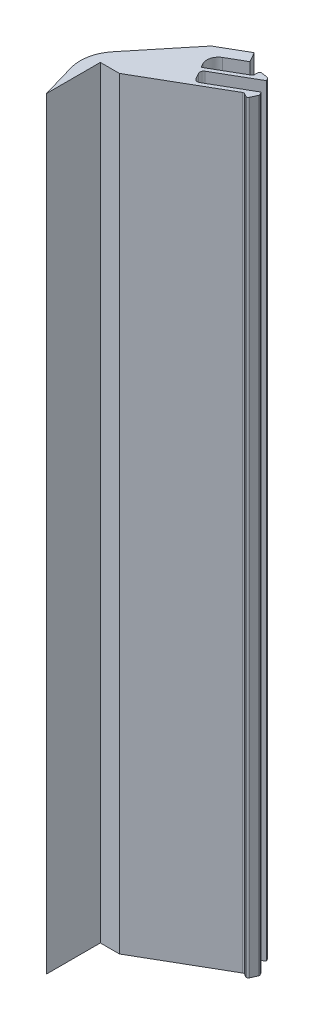
ISO-10303-21;
HEADER;
FILE_DESCRIPTION(('STEP AP214'),'2;1');
FILE_NAME('part.step','',(''),(''),'','','');
FILE_SCHEMA(('AUTOMOTIVE_DESIGN { 1 0 10303 214 1 1 1 1 }'));
ENDSEC;
DATA;
#1=APPLICATION_CONTEXT('core data for automotive mechanical design processes');
#2=APPLICATION_PROTOCOL_DEFINITION('international standard','automotive_design',2000,#1);
#3=PRODUCT_CONTEXT('',#1,'mechanical');
#4=PRODUCT('Part','Part','',(#3));
#5=PRODUCT_RELATED_PRODUCT_CATEGORY('part','',(#4));
#6=PRODUCT_DEFINITION_FORMATION('','',#4);
#7=PRODUCT_DEFINITION_CONTEXT('part definition',#1,'design');
#8=PRODUCT_DEFINITION('design','',#6,#7);
#9=PRODUCT_DEFINITION_SHAPE('','',#8);
#10=(LENGTH_UNIT() NAMED_UNIT(*) SI_UNIT(.MILLI.,.METRE.));
#11=(NAMED_UNIT(*) PLANE_ANGLE_UNIT() SI_UNIT($,.RADIAN.));
#12=(NAMED_UNIT(*) SI_UNIT($,.STERADIAN.) SOLID_ANGLE_UNIT());
#13=UNCERTAINTY_MEASURE_WITH_UNIT(LENGTH_MEASURE(1.E-05),#10,'distance_accuracy_value','');
#14=(GEOMETRIC_REPRESENTATION_CONTEXT(3) GLOBAL_UNCERTAINTY_ASSIGNED_CONTEXT((#13)) GLOBAL_UNIT_ASSIGNED_CONTEXT((#10,
#11,#12)) REPRESENTATION_CONTEXT('',''));
#15=CARTESIAN_POINT('',(0.,0.,0.));
#16=DIRECTION('',(0.,0.,1.));
#17=DIRECTION('',(1.,0.,0.));
#18=AXIS2_PLACEMENT_3D('',#15,#16,#17);
#19=CARTESIAN_POINT('',(8.1826482930344,243.460611683437,-2.42948600012822));
#20=DIRECTION('',(-0.866025403784439,0.,0.5));
#21=DIRECTION('',(0.5,0.,0.866025403784439));
#22=AXIS2_PLACEMENT_3D('',#19,#20,#21);
#23=PLANE('',#22);
#24=DIRECTION('',(-0.5,0.,-0.866025403784439));
#25=VECTOR('',#24,1.);
#26=CARTESIAN_POINT('',(8.1826482930344,0.,-2.42948600012822));
#27=LINE('',#26,#25);
#28=CARTESIAN_POINT('',(7.1826482930344,0.,-4.1615368076971));
#29=VERTEX_POINT('',#28);
#30=CARTESIAN_POINT('',(6.28264829303443,0.,-5.72038253450904));
#31=VERTEX_POINT('',#30);
#32=EDGE_CURVE('E315',#29,#31,#27,.T.);
#33=ORIENTED_EDGE('',*,*,#32,.T.);
#34=DIRECTION('',(0.,1.,0.));
#35=VECTOR('',#34,1.);
#36=CARTESIAN_POINT('',(6.28264829303443,200.,-5.72038253450904));
#37=LINE('',#36,#35);
#38=CARTESIAN_POINT('',(6.28264829303443,200.,-5.72038253450904));
#39=VERTEX_POINT('',#38);
#40=EDGE_CURVE('E423',#31,#39,#37,.T.);
#41=ORIENTED_EDGE('',*,*,#40,.T.);
#42=DIRECTION('',(-0.5,0.,-0.866025403784439));
#43=VECTOR('',#42,1.);
#44=CARTESIAN_POINT('',(8.1826482930344,200.,-2.42948600012822));
#45=LINE('',#44,#43);
#46=CARTESIAN_POINT('',(7.1826482930344,200.,-4.1615368076971));
#47=VERTEX_POINT('',#46);
#48=EDGE_CURVE('E337',#47,#39,#45,.T.);
#49=ORIENTED_EDGE('',*,*,#48,.F.);
#50=DIRECTION('',(0.,1.,0.));
#51=VECTOR('',#50,1.);
#52=CARTESIAN_POINT('',(7.1826482930344,0.,-4.1615368076971));
#53=LINE('',#52,#51);
#54=EDGE_CURVE('E421',#47,#29,#53,.F.);
#55=ORIENTED_EDGE('',*,*,#54,.T.);
#56=EDGE_LOOP('',(#33,#41,#49,#55));
#57=FACE_BOUND('',#56,.T.);
#58=ADVANCED_FACE('F32',(#57),#23,.F.);
#59=CARTESIAN_POINT('',(13.9270821271293,200.,-12.4432995431845));
#60=DIRECTION('',(0.5,0.,0.866025403784438));
#61=DIRECTION('',(0.866025403784439,0.,-0.5));
#62=AXIS2_PLACEMENT_3D('',#59,#60,#61);
#63=PLANE('',#62);
#64=DIRECTION('',(0.,-1.,0.));
#65=VECTOR('',#64,1.);
#66=CARTESIAN_POINT('',(5.28264829303443,200.,-7.45243334207792));
#67=LINE('',#66,#65);
#68=CARTESIAN_POINT('',(5.28264829303442,200.,-7.45243334207792));
#69=VERTEX_POINT('',#68);
#70=CARTESIAN_POINT('',(5.28264829303442,0.,-7.45243334207792));
#71=VERTEX_POINT('',#70);
#72=EDGE_CURVE('E324',#69,#71,#67,.T.);
#73=ORIENTED_EDGE('',*,*,#72,.F.);
#74=DIRECTION('',(-0.866025403784438,0.,0.5));
#75=VECTOR('',#74,1.);
#76=CARTESIAN_POINT('',(13.9270821271293,200.,-12.4432995431845));
#77=LINE('',#76,#75);
#78=CARTESIAN_POINT('',(13.6770821271293,200.,-12.2989619758871));
#79=VERTEX_POINT('',#78);
#80=EDGE_CURVE('E358',#79,#69,#77,.T.);
#81=ORIENTED_EDGE('',*,*,#80,.F.);
#82=DIRECTION('',(0.,-1.,0.));
#83=VECTOR('',#82,1.);
#84=CARTESIAN_POINT('',(13.6770821271293,0.,-12.2989619758871));
#85=LINE('',#84,#83);
#86=CARTESIAN_POINT('',(13.6770821271293,0.,-12.2989619758871));
#87=VERTEX_POINT('',#86);
#88=EDGE_CURVE('E405',#79,#87,#85,.T.);
#89=ORIENTED_EDGE('',*,*,#88,.T.);
#90=DIRECTION('',(-0.866025403784438,0.,0.5));
#91=VECTOR('',#90,1.);
#92=CARTESIAN_POINT('',(13.9270821271293,0.,-12.4432995431845));
#93=LINE('',#92,#91);
#94=EDGE_CURVE('E373',#87,#71,#93,.T.);
#95=ORIENTED_EDGE('',*,*,#94,.T.);
#96=EDGE_LOOP('',(#73,#81,#89,#95));
#97=FACE_BOUND('',#96,.T.);
#98=ADVANCED_FACE('F464',(#97),#63,.F.);
#99=CARTESIAN_POINT('',(16.8519532577256,200.,-12.9772741394));
#100=DIRECTION('',(-0.5,0.,-0.866025403784439));
#101=DIRECTION('',(-0.866025403784439,0.,0.5));
#102=AXIS2_PLACEMENT_3D('',#99,#100,#101);
#103=PLANE('',#102);
#104=DIRECTION('',(0.866025403784439,0.,-0.5));
#105=VECTOR('',#104,1.);
#106=CARTESIAN_POINT('',(16.8519532577256,200.,-12.9772741394));
#107=LINE('',#106,#105);
#108=CARTESIAN_POINT('',(6.64867369681886,200.,-7.08640793829348));
#109=VERTEX_POINT('',#108);
#110=CARTESIAN_POINT('',(16.8519532577256,200.,-12.9772741394));
#111=VERTEX_POINT('',#110);
#112=EDGE_CURVE('E362',#109,#111,#107,.T.);
#113=ORIENTED_EDGE('',*,*,#112,.F.);
#114=DIRECTION('',(0.,1.,0.));
#115=VECTOR('',#114,1.);
#116=CARTESIAN_POINT('',(6.64867369681886,0.,-7.08640793829348));
#117=LINE('',#116,#115);
#118=CARTESIAN_POINT('',(6.64867369681886,0.,-7.08640793829348));
#119=VERTEX_POINT('',#118);
#120=EDGE_CURVE('E426',#109,#119,#117,.F.);
#121=ORIENTED_EDGE('',*,*,#120,.T.);
#122=DIRECTION('',(0.866025403784439,0.,-0.5));
#123=VECTOR('',#122,1.);
#124=CARTESIAN_POINT('',(16.8519532577256,0.,-12.9772741394));
#125=LINE('',#124,#123);
#126=CARTESIAN_POINT('',(16.8519532577256,0.,-12.9772741394));
#127=VERTEX_POINT('',#126);
#128=EDGE_CURVE('E376',#119,#127,#125,.T.);
#129=ORIENTED_EDGE('',*,*,#128,.T.);
#130=DIRECTION('',(0.,-1.,0.));
#131=VECTOR('',#130,1.);
#132=CARTESIAN_POINT('',(16.8519532577256,200.,-12.9772741394));
#133=LINE('',#132,#131);
#134=EDGE_CURVE('E370',#111,#127,#133,.T.);
#135=ORIENTED_EDGE('',*,*,#134,.F.);
#136=EDGE_LOOP('',(#113,#121,#129,#135));
#137=FACE_BOUND('',#136,.T.);
#138=ADVANCED_FACE('F471',(#137),#103,.F.);
#139=CARTESIAN_POINT('',(13.9270821271293,200.,-14.1753503507534));
#140=DIRECTION('',(1.,0.,0.));
#141=DIRECTION('',(0.,0.,-1.));
#142=AXIS2_PLACEMENT_3D('',#139,#140,#141);
#143=PLANE('',#142);
#144=DIRECTION('',(0.,0.,1.));
#145=VECTOR('',#144,1.);
#146=CARTESIAN_POINT('',(13.9270821271293,200.,-14.1753503507534));
#147=LINE('',#146,#145);
#148=CARTESIAN_POINT('',(13.9270821271293,200.,-13.6022165712618));
#149=VERTEX_POINT('',#148);
#150=CARTESIAN_POINT('',(13.9270821271293,200.,-12.7319746777793));
#151=VERTEX_POINT('',#150);
#152=EDGE_CURVE('E355',#149,#151,#147,.T.);
#153=ORIENTED_EDGE('',*,*,#152,.F.);
#154=DIRECTION('',(0.,-1.,0.));
#155=VECTOR('',#154,1.);
#156=CARTESIAN_POINT('',(13.9270821271293,200.,-13.6022165712618));
#157=LINE('',#156,#155);
#158=CARTESIAN_POINT('',(13.9270821271293,0.,-13.6022165712618));
#159=VERTEX_POINT('',#158);
#160=EDGE_CURVE('E402',#149,#159,#157,.T.);
#161=ORIENTED_EDGE('',*,*,#160,.T.);
#162=DIRECTION('',(0.,0.,1.));
#163=VECTOR('',#162,1.);
#164=CARTESIAN_POINT('',(13.9270821271293,0.,-14.1753503507534));
#165=LINE('',#164,#163);
#166=CARTESIAN_POINT('',(13.9270821271293,0.,-12.7319746777793));
#167=VERTEX_POINT('',#166);
#168=EDGE_CURVE('E354',#159,#167,#165,.T.);
#169=ORIENTED_EDGE('',*,*,#168,.T.);
#170=DIRECTION('',(0.,-1.,0.));
#171=VECTOR('',#170,1.);
#172=CARTESIAN_POINT('',(13.9270821271293,200.,-12.7319746777793));
#173=LINE('',#172,#171);
#174=EDGE_CURVE('E400',#167,#151,#173,.F.);
#175=ORIENTED_EDGE('',*,*,#174,.T.);
#176=EDGE_LOOP('',(#153,#161,#169,#175));
#177=FACE_BOUND('',#176,.T.);
#178=ADVANCED_FACE('F496',(#177),#143,.F.);
#179=CARTESIAN_POINT('',(16.3519532577256,200.,-13.8432995431844));
#180=DIRECTION('',(-0.866025403784438,0.,0.500000000000001));
#181=DIRECTION('',(0.500000000000001,0.,0.866025403784438));
#182=AXIS2_PLACEMENT_3D('',#179,#180,#181);
#183=PLANE('',#182);
#184=DIRECTION('',(-0.500000000000001,0.,-0.866025403784438));
#185=VECTOR('',#184,1.);
#186=CARTESIAN_POINT('',(16.3519532577256,0.,-13.8432995431844));
#187=LINE('',#186,#185);
#188=CARTESIAN_POINT('',(16.4744342233498,0.,-13.6311562877632));
#189=VERTEX_POINT('',#188);
#190=EDGE_CURVE('E378',#127,#189,#187,.T.);
#191=ORIENTED_EDGE('',*,*,#190,.T.);
#192=DIRECTION('',(0.,-1.,0.));
#193=VECTOR('',#192,1.);
#194=CARTESIAN_POINT('',(16.4744342233498,200.,-13.6311562877632));
#195=LINE('',#194,#193);
#196=CARTESIAN_POINT('',(16.4744342233498,200.,-13.6311562877632));
#197=VERTEX_POINT('',#196);
#198=EDGE_CURVE('E394',#189,#197,#195,.F.);
#199=ORIENTED_EDGE('',*,*,#198,.T.);
#200=DIRECTION('',(-0.500000000000001,0.,-0.866025403784438));
#201=VECTOR('',#200,1.);
#202=CARTESIAN_POINT('',(16.3519532577256,200.,-13.8432995431844));
#203=LINE('',#202,#201);
#204=EDGE_CURVE('E364',#111,#197,#203,.T.);
#205=ORIENTED_EDGE('',*,*,#204,.F.);
#206=ORIENTED_EDGE('',*,*,#134,.T.);
#207=EDGE_LOOP('',(#191,#199,#205,#206));
#208=FACE_BOUND('',#207,.T.);
#209=ADVANCED_FACE('F513',(#208),#183,.F.);
#210=CARTESIAN_POINT('',(13.9270821271293,200.,-14.1753503507534));
#211=DIRECTION('',(-0.135669363148245,0.,0.990754169258424));
#212=DIRECTION('',(0.990754169258424,0.,0.135669363148245));
#213=AXIS2_PLACEMENT_3D('',#210,#211,#212);
#214=PLANE('',#213);
#215=DIRECTION('',(-0.990754169258424,0.,-0.135669363148245));
#216=VECTOR('',#215,1.);
#217=CARTESIAN_POINT('',(13.9270821271293,200.,-14.1753503507534));
#218=LINE('',#217,#216);
#219=CARTESIAN_POINT('',(16.1092562030317,200.,-13.8765333723924));
#220=VERTEX_POINT('',#219);
#221=CARTESIAN_POINT('',(14.4949168087034,200.,-14.097593655891));
#222=VERTEX_POINT('',#221);
#223=EDGE_CURVE('E367',#220,#222,#218,.T.);
#224=ORIENTED_EDGE('',*,*,#223,.F.);
#225=DIRECTION('',(0.,-1.,0.));
#226=VECTOR('',#225,1.);
#227=CARTESIAN_POINT('',(16.1092562030317,200.,-13.8765333723924));
#228=LINE('',#227,#226);
#229=CARTESIAN_POINT('',(16.1092562030317,0.,-13.8765333723924));
#230=VERTEX_POINT('',#229);
#231=EDGE_CURVE('E387',#220,#230,#228,.T.);
#232=ORIENTED_EDGE('',*,*,#231,.T.);
#233=DIRECTION('',(-0.990754169258424,0.,-0.135669363148245));
#234=VECTOR('',#233,1.);
#235=CARTESIAN_POINT('',(13.9270821271293,0.,-14.1753503507534));
#236=LINE('',#235,#234);
#237=CARTESIAN_POINT('',(14.4949168087034,0.,-14.097593655891));
#238=VERTEX_POINT('',#237);
#239=EDGE_CURVE('E359',#230,#238,#236,.T.);
#240=ORIENTED_EDGE('',*,*,#239,.T.);
#241=DIRECTION('',(0.,-1.,0.));
#242=VECTOR('',#241,1.);
#243=CARTESIAN_POINT('',(14.4949168087034,200.,-14.097593655891));
#244=LINE('',#243,#242);
#245=EDGE_CURVE('E385',#238,#222,#244,.F.);
#246=ORIENTED_EDGE('',*,*,#245,.T.);
#247=EDGE_LOOP('',(#224,#232,#240,#246));
#248=FACE_BOUND('',#247,.T.);
#249=ADVANCED_FACE('F504',(#248),#214,.F.);
#250=CARTESIAN_POINT('',(0.,200.,0.));
#251=DIRECTION('',(0.,1.,0.));
#252=DIRECTION('',(0.,0.,1.));
#253=AXIS2_PLACEMENT_3D('',#250,#251,#252);
#254=PLANE('',#253);
#255=DIRECTION('',(-0.632362458861427,0.,0.774672653849825));
#256=VECTOR('',#255,1.);
#257=CARTESIAN_POINT('',(1.73264829303436,200.,-13.6012137089475));
#258=LINE('',#257,#256);
#259=CARTESIAN_POINT('',(1.73264829303436,200.,-13.6012137089475));
#260=VERTEX_POINT('',#259);
#261=CARTESIAN_POINT('',(-9.84711628049156,200.,0.584522378676946));
#262=VERTEX_POINT('',#261);
#263=EDGE_CURVE('E327',#260,#262,#258,.T.);
#264=ORIENTED_EDGE('',*,*,#263,.T.);
#265=CARTESIAN_POINT('',(-2.10038974199331,200.,6.90814696729122));
#266=DIRECTION('',(0.,1.,0.));
#267=DIRECTION('',(0.,0.,1.));
#268=AXIS2_PLACEMENT_3D('',#265,#266,#267);
#269=CIRCLE('',#268,10.);
#270=CARTESIAN_POINT('',(-11.7068406298747,200.,9.68593409713461));
#271=VERTEX_POINT('',#270);
#272=EDGE_CURVE('E419',#262,#271,#269,.T.);
#273=ORIENTED_EDGE('',*,*,#272,.T.);
#274=DIRECTION('',(0.277778712984339,0.,0.960645088788135));
#275=VECTOR('',#274,1.);
#276=CARTESIAN_POINT('',(-13.1637371805032,200.,4.64753320169742));
#277=LINE('',#276,#275);
#278=CARTESIAN_POINT('',(-9.07510853066845,200.,18.7872813132227));
#279=VERTEX_POINT('',#278);
#280=EDGE_CURVE('E325',#271,#279,#277,.T.);
#281=ORIENTED_EDGE('',*,*,#280,.T.);
#282=DIRECTION('',(0.,0.,-1.));
#283=VECTOR('',#282,1.);
#284=CARTESIAN_POINT('',(-9.07510853066845,200.,18.7872813132227));
#285=LINE('',#284,#283);
#286=CARTESIAN_POINT('',(-9.07510853066845,200.,4.64753320169742));
#287=VERTEX_POINT('',#286);
#288=EDGE_CURVE('E321',#279,#287,#285,.T.);
#289=ORIENTED_EDGE('',*,*,#288,.T.);
#290=DIRECTION('',(1.,0.,0.));
#291=VECTOR('',#290,1.);
#292=CARTESIAN_POINT('',(-9.07510853066845,200.,4.64753320169742));
#293=LINE('',#292,#291);
#294=CARTESIAN_POINT('',(-4.07510853066814,200.,4.64753320169742));
#295=VERTEX_POINT('',#294);
#296=EDGE_CURVE('E293',#287,#295,#293,.T.);
#297=ORIENTED_EDGE('',*,*,#296,.T.);
#298=DIRECTION('',(0.866025403784439,0.,-0.5));
#299=VECTOR('',#298,1.);
#300=CARTESIAN_POINT('',(8.1826482930344,200.,-2.42948600012822));
#301=LINE('',#300,#299);
#302=CARTESIAN_POINT('',(16.4038770463722,200.,-7.1760146339373));
#303=VERTEX_POINT('',#302);
#304=EDGE_CURVE('E341',#295,#303,#301,.T.);
#305=ORIENTED_EDGE('',*,*,#304,.T.);
#306=CARTESIAN_POINT('',(16.6538770463722,200.,-6.74300193204508));
#307=DIRECTION('',(0.,-1.,0.));
#308=DIRECTION('',(0.,0.,-1.));
#309=AXIS2_PLACEMENT_3D('',#306,#307,#308);
#310=CIRCLE('',#309,0.5);
#311=CARTESIAN_POINT('',(16.9038770463722,200.,-7.1760146339373));
#312=VERTEX_POINT('',#311);
#313=EDGE_CURVE('E287',#303,#312,#310,.T.);
#314=ORIENTED_EDGE('',*,*,#313,.T.);
#315=DIRECTION('',(0.866025403784425,0.,0.500000000000023));
#316=VECTOR('',#315,1.);
#317=CARTESIAN_POINT('',(18.1538770463723,200.,-6.4543267974502));
#318=LINE('',#317,#316);
#319=CARTESIAN_POINT('',(17.6804654789403,200.,-6.72765109334452));
#320=VERTEX_POINT('',#319);
#321=EDGE_CURVE('E261',#312,#320,#318,.T.);
#322=ORIENTED_EDGE('',*,*,#321,.T.);
#323=CARTESIAN_POINT('',(17.9304654789404,200.,-7.16066379523674));
#324=DIRECTION('',(0.,-1.,0.));
#325=DIRECTION('',(0.,0.,-1.));
#326=AXIS2_PLACEMENT_3D('',#323,#324,#325);
#327=CIRCLE('',#326,0.5);
#328=CARTESIAN_POINT('',(18.3840018489243,200.,-6.95017683340349));
#329=VERTEX_POINT('',#328);
#330=EDGE_CURVE('E273',#320,#329,#327,.F.);
#331=ORIENTED_EDGE('',*,*,#330,.T.);
#332=DIRECTION('',(0.420973923666491,0.,-0.907072739967881));
#333=VECTOR('',#332,1.);
#334=CARTESIAN_POINT('',(19.2519532577256,200.,-8.82035220123472));
#335=LINE('',#334,#333);
#336=CARTESIAN_POINT('',(19.1426231544804,200.,-8.58477856891134));
#337=VERTEX_POINT('',#336);
#338=EDGE_CURVE('E234',#329,#337,#335,.T.);
#339=ORIENTED_EDGE('',*,*,#338,.T.);
#340=CARTESIAN_POINT('',(18.6890867844965,200.,-8.79526553074459));
#341=DIRECTION('',(0.,-1.,0.));
#342=DIRECTION('',(0.,0.,-1.));
#343=AXIS2_PLACEMENT_3D('',#340,#341,#342);
#344=CIRCLE('',#343,0.5);
#345=CARTESIAN_POINT('',(19.1220994863887,200.,-9.04526553074459));
#346=VERTEX_POINT('',#345);
#347=EDGE_CURVE('E230',#337,#346,#344,.F.);
#348=ORIENTED_EDGE('',*,*,#347,.T.);
#349=DIRECTION('',(-0.500000000000001,0.,-0.866025403784438));
#350=VECTOR('',#349,1.);
#351=CARTESIAN_POINT('',(18.7519532577255,200.,-9.68637760501915));
#352=LINE('',#351,#350);
#353=CARTESIAN_POINT('',(18.7519532577255,200.,-9.68637760501915));
#354=VERTEX_POINT('',#353);
#355=EDGE_CURVE('E222',#346,#354,#352,.T.);
#356=ORIENTED_EDGE('',*,*,#355,.T.);
#357=DIRECTION('',(-0.866025403784439,0.,0.5));
#358=VECTOR('',#357,1.);
#359=CARTESIAN_POINT('',(18.7519532577255,200.,-9.68637760501915));
#360=LINE('',#359,#358);
#361=CARTESIAN_POINT('',(8.54867369681884,200.,-3.79551140391266));
#362=VERTEX_POINT('',#361);
#363=EDGE_CURVE('E227',#354,#362,#360,.T.);
#364=ORIENTED_EDGE('',*,*,#363,.T.);
#365=CARTESIAN_POINT('',(8.04867369681884,200.,-4.6615368076971));
#366=DIRECTION('',(0.,1.,0.));
#367=DIRECTION('',(0.,0.,1.));
#368=AXIS2_PLACEMENT_3D('',#365,#366,#367);
#369=CIRCLE('',#368,1.);
#370=EDGE_CURVE('E433',#362,#47,#369,.F.);
#371=ORIENTED_EDGE('',*,*,#370,.T.);
#372=ORIENTED_EDGE('',*,*,#48,.T.);
#373=CARTESIAN_POINT('',(7.14867369681887,200.,-6.22038253450904));
#374=DIRECTION('',(0.,1.,0.));
#375=DIRECTION('',(0.,0.,1.));
#376=AXIS2_PLACEMENT_3D('',#373,#374,#375);
#377=CIRCLE('',#376,1.);
#378=EDGE_CURVE('E429',#39,#109,#377,.F.);
#379=ORIENTED_EDGE('',*,*,#378,.T.);
#380=ORIENTED_EDGE('',*,*,#112,.T.);
#381=ORIENTED_EDGE('',*,*,#204,.T.);
#382=CARTESIAN_POINT('',(16.0414215214575,200.,-13.3811562877632));
#383=DIRECTION('',(0.,1.,0.));
#384=DIRECTION('',(0.,0.,1.));
#385=AXIS2_PLACEMENT_3D('',#382,#383,#384);
#386=CIRCLE('',#385,0.5);
#387=EDGE_CURVE('E398',#197,#220,#386,.T.);
#388=ORIENTED_EDGE('',*,*,#387,.T.);
#389=ORIENTED_EDGE('',*,*,#223,.T.);
#390=CARTESIAN_POINT('',(14.4270821271293,200.,-13.6022165712618));
#391=DIRECTION('',(0.,1.,0.));
#392=DIRECTION('',(0.,0.,1.));
#393=AXIS2_PLACEMENT_3D('',#390,#391,#392);
#394=CIRCLE('',#393,0.5);
#395=EDGE_CURVE('E396',#222,#149,#394,.T.);
#396=ORIENTED_EDGE('',*,*,#395,.T.);
#397=ORIENTED_EDGE('',*,*,#152,.T.);
#398=CARTESIAN_POINT('',(13.4270821271293,200.,-12.7319746777793));
#399=DIRECTION('',(0.,1.,0.));
#400=DIRECTION('',(0.,0.,1.));
#401=AXIS2_PLACEMENT_3D('',#398,#399,#400);
#402=CIRCLE('',#401,0.5);
#403=EDGE_CURVE('E410',#151,#79,#402,.F.);
#404=ORIENTED_EDGE('',*,*,#403,.T.);
#405=ORIENTED_EDGE('',*,*,#80,.T.);
#406=CARTESIAN_POINT('',(4.73264829303435,200.,-8.40506128624094));
#407=VERTEX_POINT('',#406);
#408=EDGE_CURVE('E340',#69,#407,#45,.T.);
#409=ORIENTED_EDGE('',*,*,#408,.T.);
#410=CARTESIAN_POINT('',(7.33072450438766,200.,-9.90506128624094));
#411=DIRECTION('',(0.,1.,0.));
#412=DIRECTION('',(0.,0.,1.));
#413=AXIS2_PLACEMENT_3D('',#410,#411,#412);
#414=CIRCLE('',#413,3.);
#415=CARTESIAN_POINT('',(5.83072450438764,200.,-12.5031374975942));
#416=VERTEX_POINT('',#415);
#417=EDGE_CURVE('E11',#407,#416,#414,.F.);
#418=ORIENTED_EDGE('',*,*,#417,.T.);
#419=DIRECTION('',(0.866025403784434,0.,-0.500000000000008));
#420=VECTOR('',#419,1.);
#421=CARTESIAN_POINT('',(3.23264829303436,200.,-11.0031374975942));
#422=LINE('',#421,#420);
#423=CARTESIAN_POINT('',(10.3931119470328,200.,-15.1372331157528));
#424=VERTEX_POINT('',#423);
#425=EDGE_CURVE('E335',#416,#424,#422,.T.);
#426=ORIENTED_EDGE('',*,*,#425,.T.);
#427=DIRECTION('',(-0.5,0.,-0.866025403784439));
#428=VECTOR('',#427,1.);
#429=CARTESIAN_POINT('',(10.3931119470328,200.,-15.1372331157528));
#430=LINE('',#429,#428);
#431=CARTESIAN_POINT('',(8.89311194703281,200.,-17.7353093271062));
#432=VERTEX_POINT('',#431);
#433=EDGE_CURVE('E332',#424,#432,#430,.T.);
#434=ORIENTED_EDGE('',*,*,#433,.T.);
#435=DIRECTION('',(-0.866025403784434,0.,0.500000000000008));
#436=VECTOR('',#435,1.);
#437=CARTESIAN_POINT('',(8.89311194703281,200.,-17.7353093271062));
#438=LINE('',#437,#436);
#439=EDGE_CURVE('E329',#432,#260,#438,.T.);
#440=ORIENTED_EDGE('',*,*,#439,.T.);
#441=EDGE_LOOP('',(#264,#273,#281,#289,#297,#305,#314,#322,#331,#339,#348,#356,#364,#371,#372,
#379,#380,#381,#388,#389,#396,#397,#404,#405,#409,#418,#426,#434,#440));
#442=FACE_BOUND('',#441,.T.);
#443=ADVANCED_FACE('F225',(#442),#254,.T.);
#444=CARTESIAN_POINT('',(0.,0.,0.));
#445=DIRECTION('',(0.,1.,0.));
#446=DIRECTION('',(0.,0.,1.));
#447=AXIS2_PLACEMENT_3D('',#444,#445,#446);
#448=PLANE('',#447);
#449=DIRECTION('',(0.277778712984339,0.,0.960645088788135));
#450=VECTOR('',#449,1.);
#451=CARTESIAN_POINT('',(-13.1637371805032,0.,4.64753320169742));
#452=LINE('',#451,#450);
#453=CARTESIAN_POINT('',(-11.7068406298747,0.,9.68593409713461));
#454=VERTEX_POINT('',#453);
#455=CARTESIAN_POINT('',(-9.07510853066845,0.,18.7872813132227));
#456=VERTEX_POINT('',#455);
#457=EDGE_CURVE('E299',#454,#456,#452,.T.);
#458=ORIENTED_EDGE('',*,*,#457,.F.);
#459=CARTESIAN_POINT('',(-2.10038974199331,0.,6.90814696729122));
#460=DIRECTION('',(0.,1.,0.));
#461=DIRECTION('',(0.,0.,1.));
#462=AXIS2_PLACEMENT_3D('',#459,#460,#461);
#463=CIRCLE('',#462,10.);
#464=CARTESIAN_POINT('',(-9.84711628049156,0.,0.584522378676946));
#465=VERTEX_POINT('',#464);
#466=EDGE_CURVE('E415',#454,#465,#463,.F.);
#467=ORIENTED_EDGE('',*,*,#466,.T.);
#468=DIRECTION('',(-0.632362458861427,0.,0.774672653849825));
#469=VECTOR('',#468,1.);
#470=CARTESIAN_POINT('',(1.73264829303436,0.,-13.6012137089475));
#471=LINE('',#470,#469);
#472=CARTESIAN_POINT('',(1.73264829303436,0.,-13.6012137089475));
#473=VERTEX_POINT('',#472);
#474=EDGE_CURVE('E301',#473,#465,#471,.T.);
#475=ORIENTED_EDGE('',*,*,#474,.F.);
#476=DIRECTION('',(-0.866025403784434,0.,0.500000000000008));
#477=VECTOR('',#476,1.);
#478=CARTESIAN_POINT('',(8.89311194703281,0.,-17.7353093271062));
#479=LINE('',#478,#477);
#480=CARTESIAN_POINT('',(8.89311194703281,0.,-17.7353093271062));
#481=VERTEX_POINT('',#480);
#482=EDGE_CURVE('E305',#481,#473,#479,.T.);
#483=ORIENTED_EDGE('',*,*,#482,.F.);
#484=DIRECTION('',(-0.5,0.,-0.866025403784439));
#485=VECTOR('',#484,1.);
#486=CARTESIAN_POINT('',(10.3931119470328,0.,-15.1372331157528));
#487=LINE('',#486,#485);
#488=CARTESIAN_POINT('',(10.3931119470328,0.,-15.1372331157528));
#489=VERTEX_POINT('',#488);
#490=EDGE_CURVE('E309',#489,#481,#487,.T.);
#491=ORIENTED_EDGE('',*,*,#490,.F.);
#492=DIRECTION('',(0.866025403784434,0.,-0.500000000000008));
#493=VECTOR('',#492,1.);
#494=CARTESIAN_POINT('',(3.23264829303436,0.,-11.0031374975942));
#495=LINE('',#494,#493);
#496=CARTESIAN_POINT('',(5.83072450438764,0.,-12.5031374975942));
#497=VERTEX_POINT('',#496);
#498=EDGE_CURVE('E313',#497,#489,#495,.T.);
#499=ORIENTED_EDGE('',*,*,#498,.F.);
#500=CARTESIAN_POINT('',(7.33072450438766,0.,-9.90506128624094));
#501=DIRECTION('',(0.,1.,0.));
#502=DIRECTION('',(0.,0.,1.));
#503=AXIS2_PLACEMENT_3D('',#500,#501,#502);
#504=CIRCLE('',#503,3.);
#505=CARTESIAN_POINT('',(4.73264829303435,0.,-8.40506128624094));
#506=VERTEX_POINT('',#505);
#507=EDGE_CURVE('E40',#497,#506,#504,.T.);
#508=ORIENTED_EDGE('',*,*,#507,.T.);
#509=EDGE_CURVE('E318',#71,#506,#27,.T.);
#510=ORIENTED_EDGE('',*,*,#509,.F.);
#511=ORIENTED_EDGE('',*,*,#94,.F.);
#512=CARTESIAN_POINT('',(13.4270821271293,0.,-12.7319746777793));
#513=DIRECTION('',(0.,1.,0.));
#514=DIRECTION('',(0.,0.,1.));
#515=AXIS2_PLACEMENT_3D('',#512,#513,#514);
#516=CIRCLE('',#515,0.5);
#517=EDGE_CURVE('E408',#87,#167,#516,.T.);
#518=ORIENTED_EDGE('',*,*,#517,.T.);
#519=ORIENTED_EDGE('',*,*,#168,.F.);
#520=CARTESIAN_POINT('',(14.4270821271293,0.,-13.6022165712618));
#521=DIRECTION('',(0.,1.,0.));
#522=DIRECTION('',(0.,0.,1.));
#523=AXIS2_PLACEMENT_3D('',#520,#521,#522);
#524=CIRCLE('',#523,0.5);
#525=EDGE_CURVE('E390',#159,#238,#524,.F.);
#526=ORIENTED_EDGE('',*,*,#525,.T.);
#527=ORIENTED_EDGE('',*,*,#239,.F.);
#528=CARTESIAN_POINT('',(16.0414215214575,0.,-13.3811562877632));
#529=DIRECTION('',(0.,1.,0.));
#530=DIRECTION('',(0.,0.,1.));
#531=AXIS2_PLACEMENT_3D('',#528,#529,#530);
#532=CIRCLE('',#531,0.5);
#533=EDGE_CURVE('E392',#230,#189,#532,.F.);
#534=ORIENTED_EDGE('',*,*,#533,.T.);
#535=ORIENTED_EDGE('',*,*,#190,.F.);
#536=ORIENTED_EDGE('',*,*,#128,.F.);
#537=CARTESIAN_POINT('',(7.14867369681887,0.,-6.22038253450904));
#538=DIRECTION('',(0.,1.,0.));
#539=DIRECTION('',(0.,0.,1.));
#540=AXIS2_PLACEMENT_3D('',#537,#538,#539);
#541=CIRCLE('',#540,1.);
#542=EDGE_CURVE('E431',#119,#31,#541,.T.);
#543=ORIENTED_EDGE('',*,*,#542,.T.);
#544=ORIENTED_EDGE('',*,*,#32,.F.);
#545=CARTESIAN_POINT('',(8.04867369681884,0.,-4.6615368076971));
#546=DIRECTION('',(0.,1.,0.));
#547=DIRECTION('',(0.,0.,1.));
#548=AXIS2_PLACEMENT_3D('',#545,#546,#547);
#549=CIRCLE('',#548,1.);
#550=CARTESIAN_POINT('',(8.54867369681884,0.,-3.79551140391266));
#551=VERTEX_POINT('',#550);
#552=EDGE_CURVE('E435',#29,#551,#549,.T.);
#553=ORIENTED_EDGE('',*,*,#552,.T.);
#554=DIRECTION('',(-0.866025403784439,0.,0.5));
#555=VECTOR('',#554,1.);
#556=CARTESIAN_POINT('',(18.7519532577255,0.,-9.68637760501915));
#557=LINE('',#556,#555);
#558=CARTESIAN_POINT('',(18.7519532577255,0.,-9.68637760501915));
#559=VERTEX_POINT('',#558);
#560=EDGE_CURVE('E260',#559,#551,#557,.T.);
#561=ORIENTED_EDGE('',*,*,#560,.F.);
#562=DIRECTION('',(-0.500000000000001,0.,-0.866025403784438));
#563=VECTOR('',#562,1.);
#564=CARTESIAN_POINT('',(18.7519532577255,0.,-9.68637760501915));
#565=LINE('',#564,#563);
#566=CARTESIAN_POINT('',(19.1220994863887,0.,-9.04526553074459));
#567=VERTEX_POINT('',#566);
#568=EDGE_CURVE('E240',#567,#559,#565,.T.);
#569=ORIENTED_EDGE('',*,*,#568,.F.);
#570=CARTESIAN_POINT('',(18.6890867844965,0.,-8.79526553074459));
#571=DIRECTION('',(0.,-1.,0.));
#572=DIRECTION('',(0.,0.,-1.));
#573=AXIS2_PLACEMENT_3D('',#570,#571,#572);
#574=CIRCLE('',#573,0.5);
#575=CARTESIAN_POINT('',(19.1426231544804,0.,-8.58477856891134));
#576=VERTEX_POINT('',#575);
#577=EDGE_CURVE('E266',#567,#576,#574,.T.);
#578=ORIENTED_EDGE('',*,*,#577,.T.);
#579=DIRECTION('',(0.420973923666491,0.,-0.907072739967881));
#580=VECTOR('',#579,1.);
#581=CARTESIAN_POINT('',(19.2519532577256,0.,-8.82035220123472));
#582=LINE('',#581,#580);
#583=CARTESIAN_POINT('',(18.3840018489243,0.,-6.95017683340349));
#584=VERTEX_POINT('',#583);
#585=EDGE_CURVE('E256',#584,#576,#582,.T.);
#586=ORIENTED_EDGE('',*,*,#585,.F.);
#587=CARTESIAN_POINT('',(17.9304654789404,0.,-7.16066379523674));
#588=DIRECTION('',(0.,-1.,0.));
#589=DIRECTION('',(0.,0.,-1.));
#590=AXIS2_PLACEMENT_3D('',#587,#588,#589);
#591=CIRCLE('',#590,0.5);
#592=CARTESIAN_POINT('',(17.6804654789403,0.,-6.72765109334452));
#593=VERTEX_POINT('',#592);
#594=EDGE_CURVE('E264',#584,#593,#591,.T.);
#595=ORIENTED_EDGE('',*,*,#594,.T.);
#596=DIRECTION('',(0.866025403784425,0.,0.500000000000023));
#597=VECTOR('',#596,1.);
#598=CARTESIAN_POINT('',(18.1538770463723,0.,-6.4543267974502));
#599=LINE('',#598,#597);
#600=CARTESIAN_POINT('',(16.9038770463722,0.,-7.1760146339373));
#601=VERTEX_POINT('',#600);
#602=EDGE_CURVE('E253',#601,#593,#599,.T.);
#603=ORIENTED_EDGE('',*,*,#602,.F.);
#604=CARTESIAN_POINT('',(16.6538770463722,0.,-6.74300193204508));
#605=DIRECTION('',(0.,-1.,0.));
#606=DIRECTION('',(0.,0.,-1.));
#607=AXIS2_PLACEMENT_3D('',#604,#605,#606);
#608=CIRCLE('',#607,0.5);
#609=CARTESIAN_POINT('',(16.4038770463722,0.,-7.1760146339373));
#610=VERTEX_POINT('',#609);
#611=EDGE_CURVE('E284',#601,#610,#608,.F.);
#612=ORIENTED_EDGE('',*,*,#611,.T.);
#613=DIRECTION('',(0.866025403784439,0.,-0.5));
#614=VECTOR('',#613,1.);
#615=CARTESIAN_POINT('',(8.1826482930344,0.,-2.42948600012822));
#616=LINE('',#615,#614);
#617=CARTESIAN_POINT('',(-4.07510853066814,0.,4.64753320169742));
#618=VERTEX_POINT('',#617);
#619=EDGE_CURVE('E319',#618,#610,#616,.T.);
#620=ORIENTED_EDGE('',*,*,#619,.F.);
#621=DIRECTION('',(1.,0.,0.));
#622=VECTOR('',#621,1.);
#623=CARTESIAN_POINT('',(-9.07510853066845,0.,4.64753320169742));
#624=LINE('',#623,#622);
#625=CARTESIAN_POINT('',(-9.07510853066845,0.,4.64753320169742));
#626=VERTEX_POINT('',#625);
#627=EDGE_CURVE('E290',#626,#618,#624,.T.);
#628=ORIENTED_EDGE('',*,*,#627,.F.);
#629=DIRECTION('',(0.,0.,-1.));
#630=VECTOR('',#629,1.);
#631=CARTESIAN_POINT('',(-9.07510853066845,0.,18.7872813132227));
#632=LINE('',#631,#630);
#633=EDGE_CURVE('E295',#456,#626,#632,.T.);
#634=ORIENTED_EDGE('',*,*,#633,.F.);
#635=EDGE_LOOP('',(#458,#467,#475,#483,#491,#499,#508,#510,#511,#518,#519,#526,#527,#534,#535,
#536,#543,#544,#553,#561,#569,#578,#586,#595,#603,#612,#620,#628,#634));
#636=FACE_BOUND('',#635,.T.);
#637=ADVANCED_FACE('F449',(#636),#448,.F.);
#638=CARTESIAN_POINT('',(16.0414215214575,200.,-13.3811562877632));
#639=DIRECTION('',(0.,-1.,0.));
#640=DIRECTION('',(0.,0.,-1.));
#641=AXIS2_PLACEMENT_3D('',#638,#639,#640);
#642=CYLINDRICAL_SURFACE('',#641,0.5);
#643=ORIENTED_EDGE('',*,*,#387,.F.);
#644=ORIENTED_EDGE('',*,*,#198,.F.);
#645=ORIENTED_EDGE('',*,*,#533,.F.);
#646=ORIENTED_EDGE('',*,*,#231,.F.);
#647=EDGE_LOOP('',(#643,#644,#645,#646));
#648=FACE_BOUND('',#647,.T.);
#649=ADVANCED_FACE('F508',(#648),#642,.T.);
#650=CARTESIAN_POINT('',(14.4270821271293,200.,-13.6022165712618));
#651=DIRECTION('',(0.,-1.,0.));
#652=DIRECTION('',(0.,0.,-1.));
#653=AXIS2_PLACEMENT_3D('',#650,#651,#652);
#654=CYLINDRICAL_SURFACE('',#653,0.5);
#655=ORIENTED_EDGE('',*,*,#395,.F.);
#656=ORIENTED_EDGE('',*,*,#245,.F.);
#657=ORIENTED_EDGE('',*,*,#525,.F.);
#658=ORIENTED_EDGE('',*,*,#160,.F.);
#659=EDGE_LOOP('',(#655,#656,#657,#658));
#660=FACE_BOUND('',#659,.T.);
#661=ADVANCED_FACE('F484',(#660),#654,.T.);
#662=CARTESIAN_POINT('',(13.4270821271293,200.,-12.7319746777793));
#663=DIRECTION('',(0.,1.,0.));
#664=DIRECTION('',(0.,0.,1.));
#665=AXIS2_PLACEMENT_3D('',#662,#663,#664);
#666=CYLINDRICAL_SURFACE('',#665,0.5);
#667=ORIENTED_EDGE('',*,*,#403,.F.);
#668=ORIENTED_EDGE('',*,*,#174,.F.);
#669=ORIENTED_EDGE('',*,*,#517,.F.);
#670=ORIENTED_EDGE('',*,*,#88,.F.);
#671=EDGE_LOOP('',(#667,#668,#669,#670));
#672=FACE_BOUND('',#671,.T.);
#673=ADVANCED_FACE('F478',(#672),#666,.F.);
#674=ORIENTED_EDGE('',*,*,#509,.T.);
#675=DIRECTION('',(0.,-1.,0.));
#676=VECTOR('',#675,1.);
#677=CARTESIAN_POINT('',(4.73264829303435,200.,-8.40506128624094));
#678=LINE('',#677,#676);
#679=EDGE_CURVE('E53',#506,#407,#678,.F.);
#680=ORIENTED_EDGE('',*,*,#679,.T.);
#681=ORIENTED_EDGE('',*,*,#408,.F.);
#682=ORIENTED_EDGE('',*,*,#72,.T.);
#683=EDGE_LOOP('',(#674,#680,#681,#682));
#684=FACE_BOUND('',#683,.T.);
#685=ADVANCED_FACE('F467',(#684),#23,.F.);
#686=CARTESIAN_POINT('',(8.1826482930344,243.460611683437,-2.42948600012822));
#687=DIRECTION('',(-0.5,0.,-0.866025403784439));
#688=DIRECTION('',(-0.866025403784439,0.,0.5));
#689=AXIS2_PLACEMENT_3D('',#686,#687,#688);
#690=PLANE('',#689);
#691=DIRECTION('',(0.,-1.,0.));
#692=VECTOR('',#691,1.);
#693=CARTESIAN_POINT('',(16.4038770463722,200.,-7.1760146339373));
#694=LINE('',#693,#692);
#695=EDGE_CURVE('E281',#610,#303,#694,.F.);
#696=ORIENTED_EDGE('',*,*,#695,.T.);
#697=ORIENTED_EDGE('',*,*,#304,.F.);
#698=DIRECTION('',(0.,-1.,0.));
#699=VECTOR('',#698,1.);
#700=CARTESIAN_POINT('',(-4.07510853066814,243.460611683437,4.64753320169742));
#701=LINE('',#700,#699);
#702=EDGE_CURVE('E289',#295,#618,#701,.T.);
#703=ORIENTED_EDGE('',*,*,#702,.T.);
#704=ORIENTED_EDGE('',*,*,#619,.T.);
#705=EDGE_LOOP('',(#696,#697,#703,#704));
#706=FACE_BOUND('',#705,.T.);
#707=ADVANCED_FACE('F477',(#706),#690,.F.);
#708=CARTESIAN_POINT('',(3.23264829303436,243.460611683437,-11.0031374975942));
#709=DIRECTION('',(-0.500000000000008,0.,-0.866025403784434));
#710=DIRECTION('',(-0.866025403784434,0.,0.500000000000008));
#711=AXIS2_PLACEMENT_3D('',#708,#709,#710);
#712=PLANE('',#711);
#713=ORIENTED_EDGE('',*,*,#425,.F.);
#714=DIRECTION('',(0.,-1.,0.));
#715=VECTOR('',#714,1.);
#716=CARTESIAN_POINT('',(5.83072450438764,0.,-12.5031374975942));
#717=LINE('',#716,#715);
#718=EDGE_CURVE('E437',#416,#497,#717,.T.);
#719=ORIENTED_EDGE('',*,*,#718,.T.);
#720=ORIENTED_EDGE('',*,*,#498,.T.);
#721=DIRECTION('',(0.,-1.,0.));
#722=VECTOR('',#721,1.);
#723=CARTESIAN_POINT('',(10.3931119470328,243.460611683437,-15.1372331157528));
#724=LINE('',#723,#722);
#725=EDGE_CURVE('E312',#424,#489,#724,.T.);
#726=ORIENTED_EDGE('',*,*,#725,.F.);
#727=EDGE_LOOP('',(#713,#719,#720,#726));
#728=FACE_BOUND('',#727,.T.);
#729=ADVANCED_FACE('F443',(#728),#712,.F.);
#730=CARTESIAN_POINT('',(10.3931119470328,243.460611683437,-15.1372331157528));
#731=DIRECTION('',(-0.866025403784439,0.,0.5));
#732=DIRECTION('',(0.5,0.,0.866025403784439));
#733=AXIS2_PLACEMENT_3D('',#730,#731,#732);
#734=PLANE('',#733);
#735=ORIENTED_EDGE('',*,*,#433,.F.);
#736=ORIENTED_EDGE('',*,*,#725,.T.);
#737=ORIENTED_EDGE('',*,*,#490,.T.);
#738=DIRECTION('',(0.,-1.,0.));
#739=VECTOR('',#738,1.);
#740=CARTESIAN_POINT('',(8.89311194703281,243.460611683437,-17.7353093271062));
#741=LINE('',#740,#739);
#742=EDGE_CURVE('E308',#432,#481,#741,.T.);
#743=ORIENTED_EDGE('',*,*,#742,.F.);
#744=EDGE_LOOP('',(#735,#736,#737,#743));
#745=FACE_BOUND('',#744,.T.);
#746=ADVANCED_FACE('F455',(#745),#734,.F.);
#747=CARTESIAN_POINT('',(8.89311194703281,243.460611683437,-17.7353093271062));
#748=DIRECTION('',(0.500000000000008,0.,0.866025403784434));
#749=DIRECTION('',(0.866025403784434,0.,-0.500000000000008));
#750=AXIS2_PLACEMENT_3D('',#747,#748,#749);
#751=PLANE('',#750);
#752=ORIENTED_EDGE('',*,*,#439,.F.);
#753=ORIENTED_EDGE('',*,*,#742,.T.);
#754=ORIENTED_EDGE('',*,*,#482,.T.);
#755=DIRECTION('',(0.,-1.,0.));
#756=VECTOR('',#755,1.);
#757=CARTESIAN_POINT('',(1.73264829303436,243.460611683437,-13.6012137089475));
#758=LINE('',#757,#756);
#759=EDGE_CURVE('E304',#260,#473,#758,.T.);
#760=ORIENTED_EDGE('',*,*,#759,.F.);
#761=EDGE_LOOP('',(#752,#753,#754,#760));
#762=FACE_BOUND('',#761,.T.);
#763=ADVANCED_FACE('F568',(#762),#751,.F.);
#764=CARTESIAN_POINT('',(1.73264829303436,243.460611683437,-13.6012137089475));
#765=DIRECTION('',(0.774672653849825,0.,0.632362458861427));
#766=DIRECTION('',(0.632362458861427,0.,-0.774672653849825));
#767=AXIS2_PLACEMENT_3D('',#764,#765,#766);
#768=PLANE('',#767);
#769=ORIENTED_EDGE('',*,*,#474,.T.);
#770=DIRECTION('',(0.,-1.,0.));
#771=VECTOR('',#770,1.);
#772=CARTESIAN_POINT('',(-9.84711628049156,243.460611683437,0.584522378676943));
#773=LINE('',#772,#771);
#774=EDGE_CURVE('E417',#465,#262,#773,.F.);
#775=ORIENTED_EDGE('',*,*,#774,.T.);
#776=ORIENTED_EDGE('',*,*,#263,.F.);
#777=ORIENTED_EDGE('',*,*,#759,.T.);
#778=EDGE_LOOP('',(#769,#775,#776,#777));
#779=FACE_BOUND('',#778,.T.);
#780=ADVANCED_FACE('F564',(#779),#768,.F.);
#781=CARTESIAN_POINT('',(-13.1637371805032,243.460611683437,4.64753320169742));
#782=DIRECTION('',(0.960645088788135,0.,-0.277778712984339));
#783=DIRECTION('',(-0.277778712984339,0.,-0.960645088788135));
#784=AXIS2_PLACEMENT_3D('',#781,#782,#783);
#785=PLANE('',#784);
#786=ORIENTED_EDGE('',*,*,#280,.F.);
#787=DIRECTION('',(0.,-1.,0.));
#788=VECTOR('',#787,1.);
#789=CARTESIAN_POINT('',(-11.7068406298747,243.460611683437,9.68593409713461));
#790=LINE('',#789,#788);
#791=EDGE_CURVE('E412',#271,#454,#790,.T.);
#792=ORIENTED_EDGE('',*,*,#791,.T.);
#793=ORIENTED_EDGE('',*,*,#457,.T.);
#794=DIRECTION('',(0.,-1.,0.));
#795=VECTOR('',#794,1.);
#796=CARTESIAN_POINT('',(-9.07510853066845,243.460611683437,18.7872813132227));
#797=LINE('',#796,#795);
#798=EDGE_CURVE('E298',#279,#456,#797,.T.);
#799=ORIENTED_EDGE('',*,*,#798,.F.);
#800=EDGE_LOOP('',(#786,#792,#793,#799));
#801=FACE_BOUND('',#800,.T.);
#802=ADVANCED_FACE('F560',(#801),#785,.F.);
#803=CARTESIAN_POINT('',(-9.07510853066845,243.460611683437,18.7872813132227));
#804=DIRECTION('',(-1.,0.,0.));
#805=DIRECTION('',(0.,0.,1.));
#806=AXIS2_PLACEMENT_3D('',#803,#804,#805);
#807=PLANE('',#806);
#808=ORIENTED_EDGE('',*,*,#288,.F.);
#809=ORIENTED_EDGE('',*,*,#798,.T.);
#810=ORIENTED_EDGE('',*,*,#633,.T.);
#811=DIRECTION('',(0.,-1.,0.));
#812=VECTOR('',#811,1.);
#813=CARTESIAN_POINT('',(-9.07510853066845,243.460611683437,4.64753320169742));
#814=LINE('',#813,#812);
#815=EDGE_CURVE('E294',#287,#626,#814,.T.);
#816=ORIENTED_EDGE('',*,*,#815,.F.);
#817=EDGE_LOOP('',(#808,#809,#810,#816));
#818=FACE_BOUND('',#817,.T.);
#819=ADVANCED_FACE('F556',(#818),#807,.F.);
#820=CARTESIAN_POINT('',(-9.07510853066845,243.460611683437,4.64753320169742));
#821=DIRECTION('',(0.,0.,-1.));
#822=DIRECTION('',(-1.,0.,0.));
#823=AXIS2_PLACEMENT_3D('',#820,#821,#822);
#824=PLANE('',#823);
#825=ORIENTED_EDGE('',*,*,#296,.F.);
#826=ORIENTED_EDGE('',*,*,#815,.T.);
#827=ORIENTED_EDGE('',*,*,#627,.T.);
#828=ORIENTED_EDGE('',*,*,#702,.F.);
#829=EDGE_LOOP('',(#825,#826,#827,#828));
#830=FACE_BOUND('',#829,.T.);
#831=ADVANCED_FACE('F553',(#830),#824,.F.);
#832=CARTESIAN_POINT('',(18.7519532577255,200.,-9.68637760501915));
#833=DIRECTION('',(0.5,0.,0.866025403784439));
#834=DIRECTION('',(0.866025403784439,0.,-0.5));
#835=AXIS2_PLACEMENT_3D('',#832,#833,#834);
#836=PLANE('',#835);
#837=ORIENTED_EDGE('',*,*,#560,.T.);
#838=DIRECTION('',(0.,1.,0.));
#839=VECTOR('',#838,1.);
#840=CARTESIAN_POINT('',(8.54867369681884,200.,-3.79551140391266));
#841=LINE('',#840,#839);
#842=EDGE_CURVE('E249',#551,#362,#841,.T.);
#843=ORIENTED_EDGE('',*,*,#842,.T.);
#844=ORIENTED_EDGE('',*,*,#363,.F.);
#845=DIRECTION('',(0.,-1.,0.));
#846=VECTOR('',#845,1.);
#847=CARTESIAN_POINT('',(18.7519532577255,200.,-9.68637760501915));
#848=LINE('',#847,#846);
#849=EDGE_CURVE('E237',#354,#559,#848,.T.);
#850=ORIENTED_EDGE('',*,*,#849,.T.);
#851=EDGE_LOOP('',(#837,#843,#844,#850));
#852=FACE_BOUND('',#851,.T.);
#853=ADVANCED_FACE('F247',(#852),#836,.F.);
#854=CARTESIAN_POINT('',(18.1538770463723,200.,-6.4543267974502));
#855=DIRECTION('',(0.500000000000023,0.,-0.866025403784426));
#856=DIRECTION('',(-0.866025403784426,0.,-0.500000000000023));
#857=AXIS2_PLACEMENT_3D('',#854,#855,#856);
#858=PLANE('',#857);
#859=ORIENTED_EDGE('',*,*,#602,.T.);
#860=DIRECTION('',(0.,-1.,0.));
#861=VECTOR('',#860,1.);
#862=CARTESIAN_POINT('',(17.6804654789403,200.,-6.72765109334452));
#863=LINE('',#862,#861);
#864=EDGE_CURVE('E279',#593,#320,#863,.F.);
#865=ORIENTED_EDGE('',*,*,#864,.T.);
#866=ORIENTED_EDGE('',*,*,#321,.F.);
#867=DIRECTION('',(0.,-1.,0.));
#868=VECTOR('',#867,1.);
#869=CARTESIAN_POINT('',(16.9038770463722,0.,-7.1760146339373));
#870=LINE('',#869,#868);
#871=EDGE_CURVE('E276',#312,#601,#870,.T.);
#872=ORIENTED_EDGE('',*,*,#871,.T.);
#873=EDGE_LOOP('',(#859,#865,#866,#872));
#874=FACE_BOUND('',#873,.T.);
#875=ADVANCED_FACE('F546',(#874),#858,.F.);
#876=CARTESIAN_POINT('',(19.2519532577256,200.,-8.82035220123472));
#877=DIRECTION('',(-0.907072739967881,0.,-0.420973923666491));
#878=DIRECTION('',(-0.420973923666491,0.,0.907072739967881));
#879=AXIS2_PLACEMENT_3D('',#876,#877,#878);
#880=PLANE('',#879);
#881=ORIENTED_EDGE('',*,*,#585,.T.);
#882=DIRECTION('',(0.,-1.,0.));
#883=VECTOR('',#882,1.);
#884=CARTESIAN_POINT('',(19.1426231544804,200.,-8.58477856891134));
#885=LINE('',#884,#883);
#886=EDGE_CURVE('E271',#576,#337,#885,.F.);
#887=ORIENTED_EDGE('',*,*,#886,.T.);
#888=ORIENTED_EDGE('',*,*,#338,.F.);
#889=DIRECTION('',(0.,-1.,0.));
#890=VECTOR('',#889,1.);
#891=CARTESIAN_POINT('',(18.3840018489243,200.,-6.95017683340349));
#892=LINE('',#891,#890);
#893=EDGE_CURVE('E268',#329,#584,#892,.T.);
#894=ORIENTED_EDGE('',*,*,#893,.T.);
#895=EDGE_LOOP('',(#881,#887,#888,#894));
#896=FACE_BOUND('',#895,.T.);
#897=ADVANCED_FACE('F530',(#896),#880,.F.);
#898=CARTESIAN_POINT('',(18.7519532577255,200.,-9.68637760501915));
#899=DIRECTION('',(-0.866025403784438,0.,0.500000000000001));
#900=DIRECTION('',(0.500000000000001,0.,0.866025403784438));
#901=AXIS2_PLACEMENT_3D('',#898,#899,#900);
#902=PLANE('',#901);
#903=ORIENTED_EDGE('',*,*,#355,.F.);
#904=DIRECTION('',(0.,-1.,0.));
#905=VECTOR('',#904,1.);
#906=CARTESIAN_POINT('',(19.1220994863887,200.,-9.04526553074459));
#907=LINE('',#906,#905);
#908=EDGE_CURVE('E244',#346,#567,#907,.T.);
#909=ORIENTED_EDGE('',*,*,#908,.T.);
#910=ORIENTED_EDGE('',*,*,#568,.T.);
#911=ORIENTED_EDGE('',*,*,#849,.F.);
#912=EDGE_LOOP('',(#903,#909,#910,#911));
#913=FACE_BOUND('',#912,.T.);
#914=ADVANCED_FACE('F238',(#913),#902,.F.);
#915=CARTESIAN_POINT('',(18.6890867844965,200.,-8.79526553074459));
#916=DIRECTION('',(0.,-1.,0.));
#917=DIRECTION('',(0.,0.,-1.));
#918=AXIS2_PLACEMENT_3D('',#915,#916,#917);
#919=CYLINDRICAL_SURFACE('',#918,0.5);
#920=ORIENTED_EDGE('',*,*,#347,.F.);
#921=ORIENTED_EDGE('',*,*,#886,.F.);
#922=ORIENTED_EDGE('',*,*,#577,.F.);
#923=ORIENTED_EDGE('',*,*,#908,.F.);
#924=EDGE_LOOP('',(#920,#921,#922,#923));
#925=FACE_BOUND('',#924,.T.);
#926=ADVANCED_FACE('F533',(#925),#919,.T.);
#927=CARTESIAN_POINT('',(17.9304654789404,200.,-7.16066379523674));
#928=DIRECTION('',(0.,-1.,0.));
#929=DIRECTION('',(0.,0.,-1.));
#930=AXIS2_PLACEMENT_3D('',#927,#928,#929);
#931=CYLINDRICAL_SURFACE('',#930,0.5);
#932=ORIENTED_EDGE('',*,*,#330,.F.);
#933=ORIENTED_EDGE('',*,*,#864,.F.);
#934=ORIENTED_EDGE('',*,*,#594,.F.);
#935=ORIENTED_EDGE('',*,*,#893,.F.);
#936=EDGE_LOOP('',(#932,#933,#934,#935));
#937=FACE_BOUND('',#936,.T.);
#938=ADVANCED_FACE('F535',(#937),#931,.T.);
#939=CARTESIAN_POINT('',(16.6538770463722,200.,-6.74300193204508));
#940=DIRECTION('',(0.,1.,0.));
#941=DIRECTION('',(0.,0.,1.));
#942=AXIS2_PLACEMENT_3D('',#939,#940,#941);
#943=CYLINDRICAL_SURFACE('',#942,0.5);
#944=ORIENTED_EDGE('',*,*,#313,.F.);
#945=ORIENTED_EDGE('',*,*,#695,.F.);
#946=ORIENTED_EDGE('',*,*,#611,.F.);
#947=ORIENTED_EDGE('',*,*,#871,.F.);
#948=EDGE_LOOP('',(#944,#945,#946,#947));
#949=FACE_BOUND('',#948,.T.);
#950=ADVANCED_FACE('F541',(#949),#943,.F.);
#951=CARTESIAN_POINT('',(-2.10038974199331,243.460611683437,6.90814696729122));
#952=DIRECTION('',(0.,-1.,0.));
#953=DIRECTION('',(0.,0.,-1.));
#954=AXIS2_PLACEMENT_3D('',#951,#952,#953);
#955=CYLINDRICAL_SURFACE('',#954,10.);
#956=ORIENTED_EDGE('',*,*,#272,.F.);
#957=ORIENTED_EDGE('',*,*,#774,.F.);
#958=ORIENTED_EDGE('',*,*,#466,.F.);
#959=ORIENTED_EDGE('',*,*,#791,.F.);
#960=EDGE_LOOP('',(#956,#957,#958,#959));
#961=FACE_BOUND('',#960,.T.);
#962=ADVANCED_FACE('F551',(#961),#955,.T.);
#963=CARTESIAN_POINT('',(7.14867369681887,243.460611683437,-6.22038253450904));
#964=DIRECTION('',(0.,-1.,0.));
#965=DIRECTION('',(0.,0.,-1.));
#966=AXIS2_PLACEMENT_3D('',#963,#964,#965);
#967=CYLINDRICAL_SURFACE('',#966,1.);
#968=ORIENTED_EDGE('',*,*,#542,.F.);
#969=ORIENTED_EDGE('',*,*,#120,.F.);
#970=ORIENTED_EDGE('',*,*,#378,.F.);
#971=ORIENTED_EDGE('',*,*,#40,.F.);
#972=EDGE_LOOP('',(#968,#969,#970,#971));
#973=FACE_BOUND('',#972,.T.);
#974=ADVANCED_FACE('F461',(#973),#967,.F.);
#975=CARTESIAN_POINT('',(8.04867369681884,200.,-4.6615368076971));
#976=DIRECTION('',(0.,-1.,0.));
#977=DIRECTION('',(0.,0.,-1.));
#978=AXIS2_PLACEMENT_3D('',#975,#976,#977);
#979=CYLINDRICAL_SURFACE('',#978,1.);
#980=ORIENTED_EDGE('',*,*,#552,.F.);
#981=ORIENTED_EDGE('',*,*,#54,.F.);
#982=ORIENTED_EDGE('',*,*,#370,.F.);
#983=ORIENTED_EDGE('',*,*,#842,.F.);
#984=EDGE_LOOP('',(#980,#981,#982,#983));
#985=FACE_BOUND('',#984,.T.);
#986=ADVANCED_FACE('F457',(#985),#979,.F.);
#987=CARTESIAN_POINT('',(7.33072450438766,243.460611683437,-9.90506128624094));
#988=DIRECTION('',(0.,1.,0.));
#989=DIRECTION('',(0.,0.,1.));
#990=AXIS2_PLACEMENT_3D('',#987,#988,#989);
#991=CYLINDRICAL_SURFACE('',#990,3.);
#992=ORIENTED_EDGE('',*,*,#417,.F.);
#993=ORIENTED_EDGE('',*,*,#679,.F.);
#994=ORIENTED_EDGE('',*,*,#507,.F.);
#995=ORIENTED_EDGE('',*,*,#718,.F.);
#996=EDGE_LOOP('',(#992,#993,#994,#995));
#997=FACE_BOUND('',#996,.T.);
#998=ADVANCED_FACE('F34',(#997),#991,.F.);
#999=CLOSED_SHELL('',(#58,#98,#138,#178,#209,#249,#443,#637,#649,#661,#673,#685,#707,#729,#746,
#763,#780,#802,#819,#831,#853,#875,#897,#914,#926,#938,#950,#962,#974,#986,#998));
#1000=MANIFOLD_SOLID_BREP('B2',#999);
#1001=ADVANCED_BREP_SHAPE_REPRESENTATION('',(#18,#1000),#14);
#1002=SHAPE_DEFINITION_REPRESENTATION(#9,#1001);
ENDSEC;
END-ISO-10303-21;
